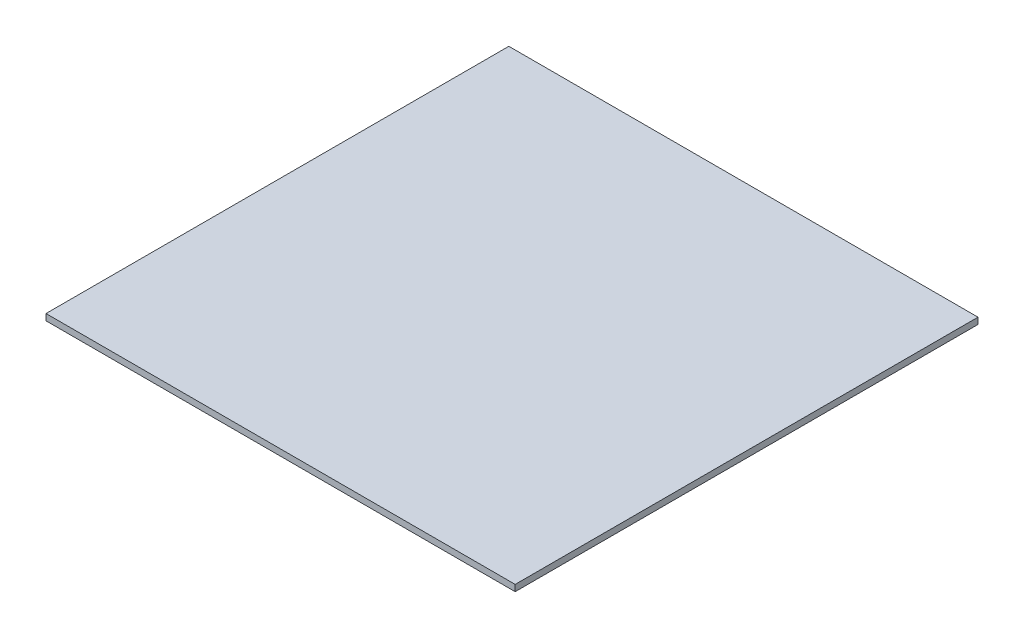
ISO-10303-21;
HEADER;
FILE_DESCRIPTION(('STEP AP214'),'2;1');
FILE_NAME('part.step','',(''),(''),'','','');
FILE_SCHEMA(('AUTOMOTIVE_DESIGN { 1 0 10303 214 1 1 1 1 }'));
ENDSEC;
DATA;
#1=APPLICATION_CONTEXT('core data for automotive mechanical design processes');
#2=APPLICATION_PROTOCOL_DEFINITION('international standard','automotive_design',2000,#1);
#3=PRODUCT_CONTEXT('',#1,'mechanical');
#4=PRODUCT('Part','Part','',(#3));
#5=PRODUCT_RELATED_PRODUCT_CATEGORY('part','',(#4));
#6=PRODUCT_DEFINITION_FORMATION('','',#4);
#7=PRODUCT_DEFINITION_CONTEXT('part definition',#1,'design');
#8=PRODUCT_DEFINITION('design','',#6,#7);
#9=PRODUCT_DEFINITION_SHAPE('','',#8);
#10=(LENGTH_UNIT() NAMED_UNIT(*) SI_UNIT(.MILLI.,.METRE.));
#11=(NAMED_UNIT(*) PLANE_ANGLE_UNIT() SI_UNIT($,.RADIAN.));
#12=(NAMED_UNIT(*) SI_UNIT($,.STERADIAN.) SOLID_ANGLE_UNIT());
#13=UNCERTAINTY_MEASURE_WITH_UNIT(LENGTH_MEASURE(1.E-05),#10,'distance_accuracy_value','');
#14=(GEOMETRIC_REPRESENTATION_CONTEXT(3) GLOBAL_UNCERTAINTY_ASSIGNED_CONTEXT((#13)) GLOBAL_UNIT_ASSIGNED_CONTEXT((#10,
#11,#12)) REPRESENTATION_CONTEXT('',''));
#15=CARTESIAN_POINT('',(0.,0.,0.));
#16=DIRECTION('',(0.,0.,1.));
#17=DIRECTION('',(1.,0.,0.));
#18=AXIS2_PLACEMENT_3D('',#15,#16,#17);
#19=CARTESIAN_POINT('',(-37.,1.,-36.5));
#20=DIRECTION('',(1.,0.,0.));
#21=DIRECTION('',(0.,0.,-1.));
#22=AXIS2_PLACEMENT_3D('',#19,#20,#21);
#23=PLANE('',#22);
#24=DIRECTION('',(0.,0.,1.));
#25=VECTOR('',#24,1.);
#26=CARTESIAN_POINT('',(-37.,0.,-36.5));
#27=LINE('',#26,#25);
#28=CARTESIAN_POINT('',(-37.,0.,-36.5));
#29=VERTEX_POINT('',#28);
#30=CARTESIAN_POINT('',(-37.,0.,36.5));
#31=VERTEX_POINT('',#30);
#32=EDGE_CURVE('E107',#29,#31,#27,.T.);
#33=ORIENTED_EDGE('',*,*,#32,.T.);
#34=DIRECTION('',(0.,-1.,0.));
#35=VECTOR('',#34,1.);
#36=CARTESIAN_POINT('',(-37.,1.,36.5));
#37=LINE('',#36,#35);
#38=CARTESIAN_POINT('',(-37.,1.,36.5));
#39=VERTEX_POINT('',#38);
#40=EDGE_CURVE('E11',#39,#31,#37,.T.);
#41=ORIENTED_EDGE('',*,*,#40,.F.);
#42=DIRECTION('',(0.,0.,1.));
#43=VECTOR('',#42,1.);
#44=CARTESIAN_POINT('',(-37.,1.,-36.5));
#45=LINE('',#44,#43);
#46=CARTESIAN_POINT('',(-37.,1.,-36.5));
#47=VERTEX_POINT('',#46);
#48=EDGE_CURVE('E91',#47,#39,#45,.T.);
#49=ORIENTED_EDGE('',*,*,#48,.F.);
#50=DIRECTION('',(0.,-1.,0.));
#51=VECTOR('',#50,1.);
#52=CARTESIAN_POINT('',(-37.,1.,-36.5));
#53=LINE('',#52,#51);
#54=EDGE_CURVE('E103',#47,#29,#53,.T.);
#55=ORIENTED_EDGE('',*,*,#54,.T.);
#56=EDGE_LOOP('',(#33,#41,#49,#55));
#57=FACE_BOUND('',#56,.T.);
#58=ADVANCED_FACE('F39',(#57),#23,.F.);
#59=CARTESIAN_POINT('',(-37.,1.,36.5));
#60=DIRECTION('',(0.,0.,-1.));
#61=DIRECTION('',(-1.,0.,0.));
#62=AXIS2_PLACEMENT_3D('',#59,#60,#61);
#63=PLANE('',#62);
#64=DIRECTION('',(1.,0.,0.));
#65=VECTOR('',#64,1.);
#66=CARTESIAN_POINT('',(-37.,0.,36.5));
#67=LINE('',#66,#65);
#68=CARTESIAN_POINT('',(37.,0.,36.5));
#69=VERTEX_POINT('',#68);
#70=EDGE_CURVE('E96',#31,#69,#67,.T.);
#71=ORIENTED_EDGE('',*,*,#70,.T.);
#72=DIRECTION('',(0.,-1.,0.));
#73=VECTOR('',#72,1.);
#74=CARTESIAN_POINT('',(37.,1.,36.5));
#75=LINE('',#74,#73);
#76=CARTESIAN_POINT('',(37.,1.,36.5));
#77=VERTEX_POINT('',#76);
#78=EDGE_CURVE('E48',#77,#69,#75,.T.);
#79=ORIENTED_EDGE('',*,*,#78,.F.);
#80=DIRECTION('',(1.,0.,0.));
#81=VECTOR('',#80,1.);
#82=CARTESIAN_POINT('',(-37.,1.,36.5));
#83=LINE('',#82,#81);
#84=EDGE_CURVE('E86',#39,#77,#83,.T.);
#85=ORIENTED_EDGE('',*,*,#84,.F.);
#86=ORIENTED_EDGE('',*,*,#40,.T.);
#87=EDGE_LOOP('',(#71,#79,#85,#86));
#88=FACE_BOUND('',#87,.T.);
#89=ADVANCED_FACE('F95',(#88),#63,.F.);
#90=CARTESIAN_POINT('',(37.,1.,-36.5));
#91=DIRECTION('',(-1.,0.,0.));
#92=DIRECTION('',(0.,0.,1.));
#93=AXIS2_PLACEMENT_3D('',#90,#91,#92);
#94=PLANE('',#93);
#95=DIRECTION('',(0.,0.,-1.));
#96=VECTOR('',#95,1.);
#97=CARTESIAN_POINT('',(37.,0.,-36.5));
#98=LINE('',#97,#96);
#99=CARTESIAN_POINT('',(37.,0.,-36.5));
#100=VERTEX_POINT('',#99);
#101=EDGE_CURVE('E73',#69,#100,#98,.T.);
#102=ORIENTED_EDGE('',*,*,#101,.T.);
#103=DIRECTION('',(0.,-1.,0.));
#104=VECTOR('',#103,1.);
#105=CARTESIAN_POINT('',(37.,1.,-36.5));
#106=LINE('',#105,#104);
#107=CARTESIAN_POINT('',(37.,1.,-36.5));
#108=VERTEX_POINT('',#107);
#109=EDGE_CURVE('E98',#108,#100,#106,.T.);
#110=ORIENTED_EDGE('',*,*,#109,.F.);
#111=DIRECTION('',(0.,0.,-1.));
#112=VECTOR('',#111,1.);
#113=CARTESIAN_POINT('',(37.,1.,-36.5));
#114=LINE('',#113,#112);
#115=EDGE_CURVE('E89',#77,#108,#114,.T.);
#116=ORIENTED_EDGE('',*,*,#115,.F.);
#117=ORIENTED_EDGE('',*,*,#78,.T.);
#118=EDGE_LOOP('',(#102,#110,#116,#117));
#119=FACE_BOUND('',#118,.T.);
#120=ADVANCED_FACE('F99',(#119),#94,.F.);
#121=CARTESIAN_POINT('',(-37.,1.,-36.5));
#122=DIRECTION('',(0.,0.,1.));
#123=DIRECTION('',(1.,0.,0.));
#124=AXIS2_PLACEMENT_3D('',#121,#122,#123);
#125=PLANE('',#124);
#126=DIRECTION('',(-1.,0.,0.));
#127=VECTOR('',#126,1.);
#128=CARTESIAN_POINT('',(-37.,0.,-36.5));
#129=LINE('',#128,#127);
#130=EDGE_CURVE('E79',#100,#29,#129,.T.);
#131=ORIENTED_EDGE('',*,*,#130,.T.);
#132=ORIENTED_EDGE('',*,*,#54,.F.);
#133=DIRECTION('',(-1.,0.,0.));
#134=VECTOR('',#133,1.);
#135=CARTESIAN_POINT('',(-37.,1.,-36.5));
#136=LINE('',#135,#134);
#137=EDGE_CURVE('E56',#108,#47,#136,.T.);
#138=ORIENTED_EDGE('',*,*,#137,.F.);
#139=ORIENTED_EDGE('',*,*,#109,.T.);
#140=EDGE_LOOP('',(#131,#132,#138,#139));
#141=FACE_BOUND('',#140,.T.);
#142=ADVANCED_FACE('F120',(#141),#125,.F.);
#143=CARTESIAN_POINT('',(0.,1.,0.));
#144=DIRECTION('',(0.,1.,0.));
#145=DIRECTION('',(0.,0.,1.));
#146=AXIS2_PLACEMENT_3D('',#143,#144,#145);
#147=PLANE('',#146);
#148=ORIENTED_EDGE('',*,*,#48,.T.);
#149=ORIENTED_EDGE('',*,*,#84,.T.);
#150=ORIENTED_EDGE('',*,*,#115,.T.);
#151=ORIENTED_EDGE('',*,*,#137,.T.);
#152=EDGE_LOOP('',(#148,#149,#150,#151));
#153=FACE_BOUND('',#152,.T.);
#154=ADVANCED_FACE('F87',(#153),#147,.T.);
#155=CARTESIAN_POINT('',(0.,0.,0.));
#156=DIRECTION('',(0.,1.,0.));
#157=DIRECTION('',(0.,0.,1.));
#158=AXIS2_PLACEMENT_3D('',#155,#156,#157);
#159=PLANE('',#158);
#160=ORIENTED_EDGE('',*,*,#32,.F.);
#161=ORIENTED_EDGE('',*,*,#130,.F.);
#162=ORIENTED_EDGE('',*,*,#101,.F.);
#163=ORIENTED_EDGE('',*,*,#70,.F.);
#164=EDGE_LOOP('',(#160,#161,#162,#163));
#165=FACE_BOUND('',#164,.T.);
#166=ADVANCED_FACE('F123',(#165),#159,.F.);
#167=CLOSED_SHELL('',(#58,#89,#120,#142,#154,#166));
#168=MANIFOLD_SOLID_BREP('B2',#167);
#169=ADVANCED_BREP_SHAPE_REPRESENTATION('',(#18,#168),#14);
#170=SHAPE_DEFINITION_REPRESENTATION(#9,#169);
ENDSEC;
END-ISO-10303-21;
